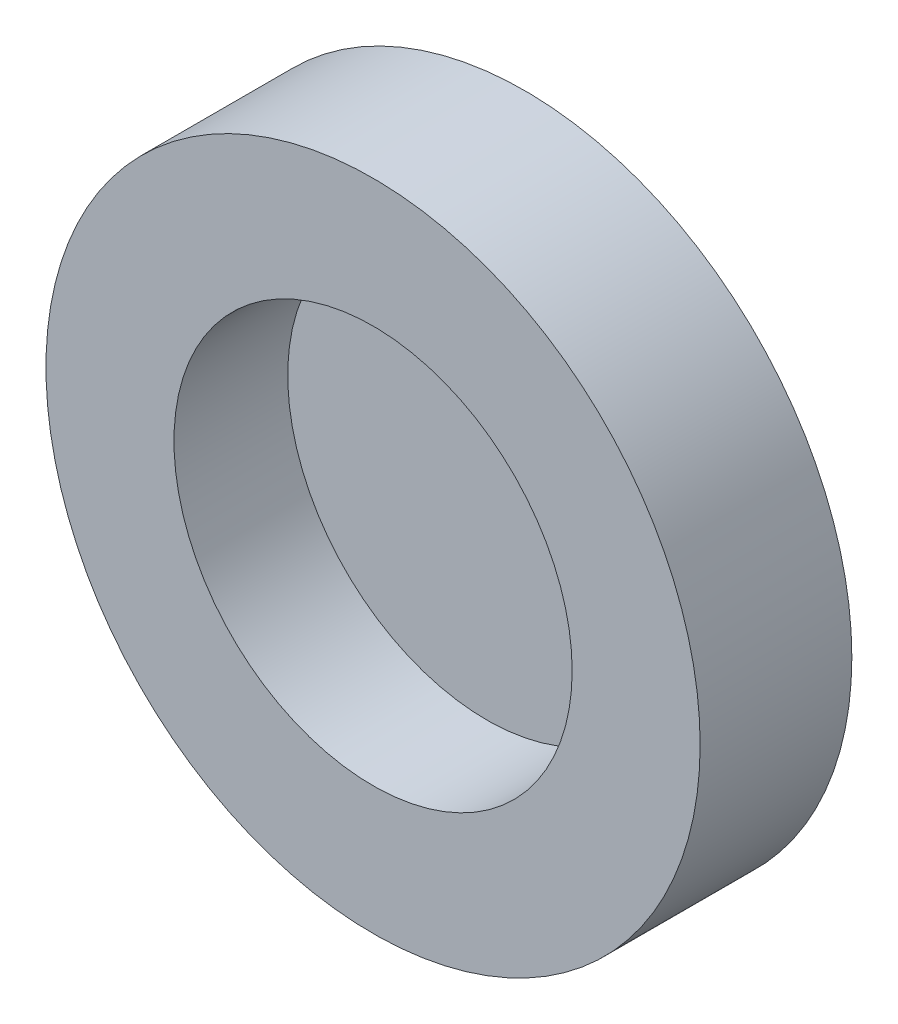
ISO-10303-21;
HEADER;
FILE_DESCRIPTION(('STEP AP214'),'2;1');
FILE_NAME('part.step','',(''),(''),'','','');
FILE_SCHEMA(('AUTOMOTIVE_DESIGN { 1 0 10303 214 1 1 1 1 }'));
ENDSEC;
DATA;
#1=APPLICATION_CONTEXT('core data for automotive mechanical design processes');
#2=APPLICATION_PROTOCOL_DEFINITION('international standard','automotive_design',2000,#1);
#3=PRODUCT_CONTEXT('',#1,'mechanical');
#4=PRODUCT('Part','Part','',(#3));
#5=PRODUCT_RELATED_PRODUCT_CATEGORY('part','',(#4));
#6=PRODUCT_DEFINITION_FORMATION('','',#4);
#7=PRODUCT_DEFINITION_CONTEXT('part definition',#1,'design');
#8=PRODUCT_DEFINITION('design','',#6,#7);
#9=PRODUCT_DEFINITION_SHAPE('','',#8);
#10=(LENGTH_UNIT() NAMED_UNIT(*) SI_UNIT(.MILLI.,.METRE.));
#11=(NAMED_UNIT(*) PLANE_ANGLE_UNIT() SI_UNIT($,.RADIAN.));
#12=(NAMED_UNIT(*) SI_UNIT($,.STERADIAN.) SOLID_ANGLE_UNIT());
#13=UNCERTAINTY_MEASURE_WITH_UNIT(LENGTH_MEASURE(1.E-05),#10,'distance_accuracy_value','');
#14=(GEOMETRIC_REPRESENTATION_CONTEXT(3) GLOBAL_UNCERTAINTY_ASSIGNED_CONTEXT((#13)) GLOBAL_UNIT_ASSIGNED_CONTEXT((#10,
#11,#12)) REPRESENTATION_CONTEXT('',''));
#15=CARTESIAN_POINT('',(0.,0.,0.));
#16=DIRECTION('',(0.,0.,1.));
#17=DIRECTION('',(1.,0.,0.));
#18=AXIS2_PLACEMENT_3D('',#15,#16,#17);
#19=CARTESIAN_POINT('',(0.,0.,8.));
#20=DIRECTION('',(0.,0.,-1.));
#21=DIRECTION('',(-1.,0.,0.));
#22=AXIS2_PLACEMENT_3D('',#19,#20,#21);
#23=CYLINDRICAL_SURFACE('',#22,17.25);
#24=CARTESIAN_POINT('',(0.,0.,8.));
#25=DIRECTION('',(0.,0.,1.));
#26=DIRECTION('',(1.,0.,0.));
#27=AXIS2_PLACEMENT_3D('',#24,#25,#26);
#28=CIRCLE('',#27,17.25);
#29=CARTESIAN_POINT('',(17.25,0.,8.));
#30=VERTEX_POINT('',#29);
#31=EDGE_CURVE('E10',#30,#30,#28,.T.);
#32=ORIENTED_EDGE('',*,*,#31,.F.);
#33=EDGE_LOOP('',(#32));
#34=FACE_BOUND('',#33,.T.);
#35=CARTESIAN_POINT('',(0.,0.,0.));
#36=DIRECTION('',(0.,0.,1.));
#37=DIRECTION('',(1.,0.,0.));
#38=AXIS2_PLACEMENT_3D('',#35,#36,#37);
#39=CIRCLE('',#38,17.25);
#40=CARTESIAN_POINT('',(17.25,0.,0.));
#41=VERTEX_POINT('',#40);
#42=EDGE_CURVE('E40',#41,#41,#39,.T.);
#43=ORIENTED_EDGE('',*,*,#42,.T.);
#44=EDGE_LOOP('',(#43));
#45=FACE_BOUND('',#44,.T.);
#46=ADVANCED_FACE('F33',(#34,#45),#23,.T.);
#47=CARTESIAN_POINT('',(0.,0.,8.));
#48=DIRECTION('',(0.,0.,1.));
#49=DIRECTION('',(1.,0.,0.));
#50=AXIS2_PLACEMENT_3D('',#47,#48,#49);
#51=PLANE('',#50);
#52=CARTESIAN_POINT('',(0.,0.,8.));
#53=DIRECTION('',(0.,0.,1.));
#54=DIRECTION('',(1.,0.,0.));
#55=AXIS2_PLACEMENT_3D('',#52,#53,#54);
#56=CIRCLE('',#55,10.5);
#57=CARTESIAN_POINT('',(10.5,0.,8.));
#58=VERTEX_POINT('',#57);
#59=EDGE_CURVE('E36',#58,#58,#56,.F.);
#60=ORIENTED_EDGE('',*,*,#59,.T.);
#61=EDGE_LOOP('',(#60));
#62=FACE_BOUND('',#61,.T.);
#63=ORIENTED_EDGE('',*,*,#31,.T.);
#64=EDGE_LOOP('',(#63));
#65=FACE_BOUND('',#64,.T.);
#66=ADVANCED_FACE('F53',(#62,#65),#51,.T.);
#67=CARTESIAN_POINT('',(0.,0.,0.));
#68=DIRECTION('',(0.,0.,1.));
#69=DIRECTION('',(1.,0.,0.));
#70=AXIS2_PLACEMENT_3D('',#67,#68,#69);
#71=PLANE('',#70);
#72=ORIENTED_EDGE('',*,*,#42,.F.);
#73=EDGE_LOOP('',(#72));
#74=FACE_BOUND('',#73,.T.);
#75=ADVANCED_FACE('F59',(#74),#71,.F.);
#76=CARTESIAN_POINT('',(0.,0.,9.));
#77=DIRECTION('',(0.,0.,-1.));
#78=DIRECTION('',(-1.,0.,0.));
#79=AXIS2_PLACEMENT_3D('',#76,#77,#78);
#80=CYLINDRICAL_SURFACE('',#79,10.5);
#81=ORIENTED_EDGE('',*,*,#59,.F.);
#82=EDGE_LOOP('',(#81));
#83=FACE_BOUND('',#82,.T.);
#84=CARTESIAN_POINT('',(0.,0.,2.));
#85=DIRECTION('',(0.,0.,1.));
#86=DIRECTION('',(1.,0.,0.));
#87=AXIS2_PLACEMENT_3D('',#84,#85,#86);
#88=CIRCLE('',#87,10.5);
#89=CARTESIAN_POINT('',(10.5,0.,2.));
#90=VERTEX_POINT('',#89);
#91=EDGE_CURVE('E46',#90,#90,#88,.T.);
#92=ORIENTED_EDGE('',*,*,#91,.F.);
#93=EDGE_LOOP('',(#92));
#94=FACE_BOUND('',#93,.T.);
#95=ADVANCED_FACE('F55',(#83,#94),#80,.F.);
#96=CARTESIAN_POINT('',(0.,0.,2.));
#97=DIRECTION('',(0.,0.,1.));
#98=DIRECTION('',(1.,0.,0.));
#99=AXIS2_PLACEMENT_3D('',#96,#97,#98);
#100=PLANE('',#99);
#101=ORIENTED_EDGE('',*,*,#91,.T.);
#102=EDGE_LOOP('',(#101));
#103=FACE_BOUND('',#102,.T.);
#104=ADVANCED_FACE('F58',(#103),#100,.T.);
#105=CLOSED_SHELL('',(#46,#66,#75,#95,#104));
#106=MANIFOLD_SOLID_BREP('B2',#105);
#107=ADVANCED_BREP_SHAPE_REPRESENTATION('',(#18,#106),#14);
#108=SHAPE_DEFINITION_REPRESENTATION(#9,#107);
ENDSEC;
END-ISO-10303-21;
